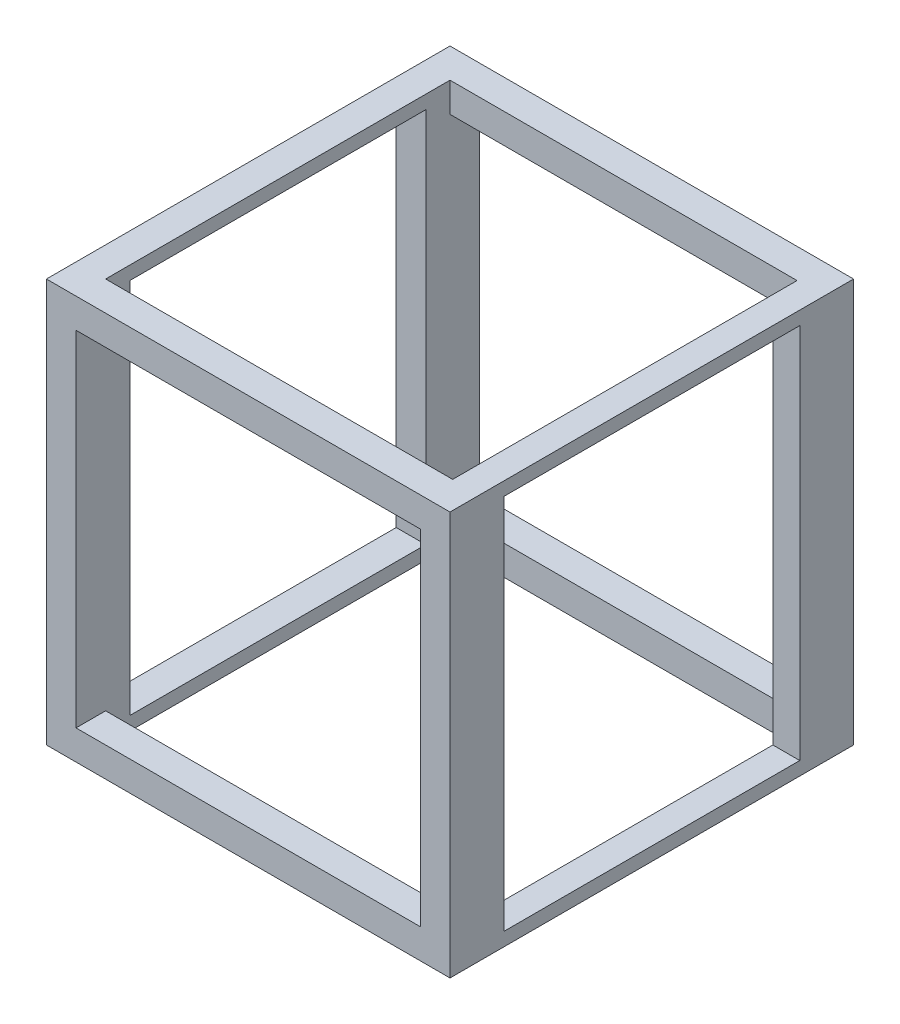
ISO-10303-21;
HEADER;
FILE_DESCRIPTION(('STEP AP214'),'2;1');
FILE_NAME('part.step','',(''),(''),'','','');
FILE_SCHEMA(('AUTOMOTIVE_DESIGN { 1 0 10303 214 1 1 1 1 }'));
ENDSEC;
DATA;
#1=APPLICATION_CONTEXT('core data for automotive mechanical design processes');
#2=APPLICATION_PROTOCOL_DEFINITION('international standard','automotive_design',2000,#1);
#3=PRODUCT_CONTEXT('',#1,'mechanical');
#4=PRODUCT('Part','Part','',(#3));
#5=PRODUCT_RELATED_PRODUCT_CATEGORY('part','',(#4));
#6=PRODUCT_DEFINITION_FORMATION('','',#4);
#7=PRODUCT_DEFINITION_CONTEXT('part definition',#1,'design');
#8=PRODUCT_DEFINITION('design','',#6,#7);
#9=PRODUCT_DEFINITION_SHAPE('','',#8);
#10=(LENGTH_UNIT() NAMED_UNIT(*) SI_UNIT(.MILLI.,.METRE.));
#11=(NAMED_UNIT(*) PLANE_ANGLE_UNIT() SI_UNIT($,.RADIAN.));
#12=(NAMED_UNIT(*) SI_UNIT($,.STERADIAN.) SOLID_ANGLE_UNIT());
#13=UNCERTAINTY_MEASURE_WITH_UNIT(LENGTH_MEASURE(1.E-05),#10,'distance_accuracy_value','');
#14=(GEOMETRIC_REPRESENTATION_CONTEXT(3) GLOBAL_UNCERTAINTY_ASSIGNED_CONTEXT((#13)) GLOBAL_UNIT_ASSIGNED_CONTEXT((#10,
#11,#12)) REPRESENTATION_CONTEXT('',''));
#15=CARTESIAN_POINT('',(0.,0.,0.));
#16=DIRECTION('',(0.,0.,1.));
#17=DIRECTION('',(1.,0.,0.));
#18=AXIS2_PLACEMENT_3D('',#15,#16,#17);
#19=CARTESIAN_POINT('',(0.,50.,-1300.));
#20=DIRECTION('',(0.,0.,-1.));
#21=DIRECTION('',(0.,1.,0.));
#22=AXIS2_PLACEMENT_3D('',#19,#20,#21);
#23=PLANE('',#22);
#24=DIRECTION('',(1.,0.,0.));
#25=VECTOR('',#24,1.);
#26=CARTESIAN_POINT('',(0.,1450.,-1300.));
#27=LINE('',#26,#25);
#28=CARTESIAN_POINT('',(1400.,1450.,-1300.));
#29=VERTEX_POINT('',#28);
#30=CARTESIAN_POINT('',(1500.,1450.,-1300.));
#31=VERTEX_POINT('',#30);
#32=EDGE_CURVE('E329',#29,#31,#27,.T.);
#33=ORIENTED_EDGE('',*,*,#32,.F.);
#34=DIRECTION('',(0.,-1.,0.));
#35=VECTOR('',#34,1.);
#36=CARTESIAN_POINT('',(1400.,50.,-1300.));
#37=LINE('',#36,#35);
#38=CARTESIAN_POINT('',(1400.,50.,-1300.));
#39=VERTEX_POINT('',#38);
#40=EDGE_CURVE('E262',#29,#39,#37,.T.);
#41=ORIENTED_EDGE('',*,*,#40,.T.);
#42=DIRECTION('',(1.,0.,0.));
#43=VECTOR('',#42,1.);
#44=CARTESIAN_POINT('',(0.,50.,-1300.));
#45=LINE('',#44,#43);
#46=CARTESIAN_POINT('',(1500.,50.,-1300.));
#47=VERTEX_POINT('',#46);
#48=EDGE_CURVE('E334',#39,#47,#45,.T.);
#49=ORIENTED_EDGE('',*,*,#48,.T.);
#50=DIRECTION('',(0.,1.,0.));
#51=VECTOR('',#50,1.);
#52=CARTESIAN_POINT('',(1500.,50.,-1300.));
#53=LINE('',#52,#51);
#54=EDGE_CURVE('E305',#47,#31,#53,.T.);
#55=ORIENTED_EDGE('',*,*,#54,.T.);
#56=EDGE_LOOP('',(#33,#41,#49,#55));
#57=FACE_BOUND('',#56,.T.);
#58=ADVANCED_FACE('F34',(#57),#23,.F.);
#59=CARTESIAN_POINT('',(0.,50.,-1300.));
#60=DIRECTION('',(0.,-1.,0.));
#61=DIRECTION('',(0.,0.,-1.));
#62=AXIS2_PLACEMENT_3D('',#59,#60,#61);
#63=PLANE('',#62);
#64=ORIENTED_EDGE('',*,*,#48,.F.);
#65=DIRECTION('',(0.,0.,1.));
#66=VECTOR('',#65,1.);
#67=CARTESIAN_POINT('',(1400.,50.,-1300.));
#68=LINE('',#67,#66);
#69=CARTESIAN_POINT('',(1400.,49.9999999999999,-200.));
#70=VERTEX_POINT('',#69);
#71=EDGE_CURVE('E259',#39,#70,#68,.T.);
#72=ORIENTED_EDGE('',*,*,#71,.T.);
#73=DIRECTION('',(1.,0.,0.));
#74=VECTOR('',#73,1.);
#75=CARTESIAN_POINT('',(-2.22044604925031E-13,49.9999999999999,-200.));
#76=LINE('',#75,#74);
#77=CARTESIAN_POINT('',(1500.,49.9999999999999,-200.));
#78=VERTEX_POINT('',#77);
#79=EDGE_CURVE('E338',#70,#78,#76,.T.);
#80=ORIENTED_EDGE('',*,*,#79,.T.);
#81=DIRECTION('',(0.,0.,-1.));
#82=VECTOR('',#81,1.);
#83=CARTESIAN_POINT('',(1500.,50.,-1300.));
#84=LINE('',#83,#82);
#85=EDGE_CURVE('E314',#78,#47,#84,.T.);
#86=ORIENTED_EDGE('',*,*,#85,.T.);
#87=EDGE_LOOP('',(#64,#72,#80,#86));
#88=FACE_BOUND('',#87,.T.);
#89=ADVANCED_FACE('F428',(#88),#63,.F.);
#90=CARTESIAN_POINT('',(-2.22044604925031E-13,49.9999999999999,-200.));
#91=DIRECTION('',(0.,0.,1.));
#92=DIRECTION('',(0.,-1.,0.));
#93=AXIS2_PLACEMENT_3D('',#90,#91,#92);
#94=PLANE('',#93);
#95=ORIENTED_EDGE('',*,*,#79,.F.);
#96=DIRECTION('',(0.,1.,0.));
#97=VECTOR('',#96,1.);
#98=CARTESIAN_POINT('',(1400.,49.9999999999999,-200.));
#99=LINE('',#98,#97);
#100=CARTESIAN_POINT('',(1400.,1450.,-200.));
#101=VERTEX_POINT('',#100);
#102=EDGE_CURVE('E256',#70,#101,#99,.T.);
#103=ORIENTED_EDGE('',*,*,#102,.T.);
#104=DIRECTION('',(1.,0.,0.));
#105=VECTOR('',#104,1.);
#106=CARTESIAN_POINT('',(-2.22044604925031E-13,1450.,-200.));
#107=LINE('',#106,#105);
#108=CARTESIAN_POINT('',(1500.,1450.,-200.));
#109=VERTEX_POINT('',#108);
#110=EDGE_CURVE('E342',#101,#109,#107,.T.);
#111=ORIENTED_EDGE('',*,*,#110,.T.);
#112=DIRECTION('',(0.,-1.,0.));
#113=VECTOR('',#112,1.);
#114=CARTESIAN_POINT('',(1500.,49.9999999999999,-200.));
#115=LINE('',#114,#113);
#116=EDGE_CURVE('E311',#109,#78,#115,.T.);
#117=ORIENTED_EDGE('',*,*,#116,.T.);
#118=EDGE_LOOP('',(#95,#103,#111,#117));
#119=FACE_BOUND('',#118,.T.);
#120=ADVANCED_FACE('F435',(#119),#94,.F.);
#121=CARTESIAN_POINT('',(0.,1450.,-1300.));
#122=DIRECTION('',(0.,1.,0.));
#123=DIRECTION('',(0.,0.,1.));
#124=AXIS2_PLACEMENT_3D('',#121,#122,#123);
#125=PLANE('',#124);
#126=ORIENTED_EDGE('',*,*,#110,.F.);
#127=DIRECTION('',(0.,0.,-1.));
#128=VECTOR('',#127,1.);
#129=CARTESIAN_POINT('',(1400.,1450.,-1300.));
#130=LINE('',#129,#128);
#131=EDGE_CURVE('E11',#101,#29,#130,.T.);
#132=ORIENTED_EDGE('',*,*,#131,.T.);
#133=ORIENTED_EDGE('',*,*,#32,.T.);
#134=DIRECTION('',(0.,0.,1.));
#135=VECTOR('',#134,1.);
#136=CARTESIAN_POINT('',(1500.,1450.,-1300.));
#137=LINE('',#136,#135);
#138=EDGE_CURVE('E308',#31,#109,#137,.T.);
#139=ORIENTED_EDGE('',*,*,#138,.T.);
#140=EDGE_LOOP('',(#126,#132,#133,#139));
#141=FACE_BOUND('',#140,.T.);
#142=ADVANCED_FACE('F467',(#141),#125,.F.);
#143=CARTESIAN_POINT('',(0.,1500.,0.));
#144=DIRECTION('',(1.,0.,0.));
#145=DIRECTION('',(0.,0.,-1.));
#146=AXIS2_PLACEMENT_3D('',#143,#144,#145);
#147=PLANE('',#146);
#148=DIRECTION('',(0.,0.,-1.));
#149=VECTOR('',#148,1.);
#150=CARTESIAN_POINT('',(0.,50.,-1300.));
#151=LINE('',#150,#149);
#152=CARTESIAN_POINT('',(-2.22044604925031E-13,49.9999999999999,-200.));
#153=VERTEX_POINT('',#152);
#154=CARTESIAN_POINT('',(0.,50.,-1300.));
#155=VERTEX_POINT('',#154);
#156=EDGE_CURVE('E326',#153,#155,#151,.T.);
#157=ORIENTED_EDGE('',*,*,#156,.T.);
#158=DIRECTION('',(0.,1.,0.));
#159=VECTOR('',#158,1.);
#160=CARTESIAN_POINT('',(0.,50.,-1300.));
#161=LINE('',#160,#159);
#162=CARTESIAN_POINT('',(0.,1450.,-1300.));
#163=VERTEX_POINT('',#162);
#164=EDGE_CURVE('E317',#155,#163,#161,.T.);
#165=ORIENTED_EDGE('',*,*,#164,.T.);
#166=DIRECTION('',(0.,0.,1.));
#167=VECTOR('',#166,1.);
#168=CARTESIAN_POINT('',(0.,1450.,-1300.));
#169=LINE('',#168,#167);
#170=CARTESIAN_POINT('',(0.,1450.,-200.));
#171=VERTEX_POINT('',#170);
#172=EDGE_CURVE('E320',#163,#171,#169,.T.);
#173=ORIENTED_EDGE('',*,*,#172,.T.);
#174=DIRECTION('',(0.,-1.,0.));
#175=VECTOR('',#174,1.);
#176=CARTESIAN_POINT('',(-2.22044604925031E-13,49.9999999999999,-200.));
#177=LINE('',#176,#175);
#178=EDGE_CURVE('E323',#171,#153,#177,.T.);
#179=ORIENTED_EDGE('',*,*,#178,.T.);
#180=EDGE_LOOP('',(#157,#165,#173,#179));
#181=FACE_BOUND('',#180,.T.);
#182=DIRECTION('',(0.,0.,1.));
#183=VECTOR('',#182,1.);
#184=CARTESIAN_POINT('',(0.,0.,0.));
#185=LINE('',#184,#183);
#186=CARTESIAN_POINT('',(0.,0.,-1500.));
#187=VERTEX_POINT('',#186);
#188=CARTESIAN_POINT('',(0.,0.,0.));
#189=VERTEX_POINT('',#188);
#190=EDGE_CURVE('E333',#187,#189,#185,.T.);
#191=ORIENTED_EDGE('',*,*,#190,.T.);
#192=DIRECTION('',(0.,-1.,0.));
#193=VECTOR('',#192,1.);
#194=CARTESIAN_POINT('',(0.,1500.,0.));
#195=LINE('',#194,#193);
#196=CARTESIAN_POINT('',(0.,1500.,0.));
#197=VERTEX_POINT('',#196);
#198=EDGE_CURVE('E372',#197,#189,#195,.T.);
#199=ORIENTED_EDGE('',*,*,#198,.F.);
#200=DIRECTION('',(0.,0.,1.));
#201=VECTOR('',#200,1.);
#202=CARTESIAN_POINT('',(0.,1500.,0.));
#203=LINE('',#202,#201);
#204=CARTESIAN_POINT('',(0.,1500.,-1500.));
#205=VERTEX_POINT('',#204);
#206=EDGE_CURVE('E346',#205,#197,#203,.T.);
#207=ORIENTED_EDGE('',*,*,#206,.F.);
#208=DIRECTION('',(0.,-1.,0.));
#209=VECTOR('',#208,1.);
#210=CARTESIAN_POINT('',(0.,1500.,-1500.));
#211=LINE('',#210,#209);
#212=EDGE_CURVE('E356',#205,#187,#211,.T.);
#213=ORIENTED_EDGE('',*,*,#212,.T.);
#214=EDGE_LOOP('',(#191,#199,#207,#213));
#215=FACE_BOUND('',#214,.T.);
#216=ADVANCED_FACE('F36',(#181,#215),#147,.F.);
#217=CARTESIAN_POINT('',(0.,1500.,0.));
#218=DIRECTION('',(0.,0.,-1.));
#219=DIRECTION('',(-1.,0.,0.));
#220=AXIS2_PLACEMENT_3D('',#217,#218,#219);
#221=PLANE('',#220);
#222=DIRECTION('',(1.,0.,0.));
#223=VECTOR('',#222,1.);
#224=CARTESIAN_POINT('',(1390.,1390.,0.));
#225=LINE('',#224,#223);
#226=CARTESIAN_POINT('',(110.,1390.,0.));
#227=VERTEX_POINT('',#226);
#228=CARTESIAN_POINT('',(1390.,1390.,0.));
#229=VERTEX_POINT('',#228);
#230=EDGE_CURVE('E286',#227,#229,#225,.T.);
#231=ORIENTED_EDGE('',*,*,#230,.T.);
#232=DIRECTION('',(0.,-1.,0.));
#233=VECTOR('',#232,1.);
#234=CARTESIAN_POINT('',(1390.,1390.,0.));
#235=LINE('',#234,#233);
#236=CARTESIAN_POINT('',(1390.,110.,0.));
#237=VERTEX_POINT('',#236);
#238=EDGE_CURVE('E277',#229,#237,#235,.T.);
#239=ORIENTED_EDGE('',*,*,#238,.T.);
#240=DIRECTION('',(-1.,0.,0.));
#241=VECTOR('',#240,1.);
#242=CARTESIAN_POINT('',(1390.,110.,0.));
#243=LINE('',#242,#241);
#244=CARTESIAN_POINT('',(110.,110.,0.));
#245=VERTEX_POINT('',#244);
#246=EDGE_CURVE('E280',#237,#245,#243,.T.);
#247=ORIENTED_EDGE('',*,*,#246,.T.);
#248=DIRECTION('',(0.,1.,0.));
#249=VECTOR('',#248,1.);
#250=CARTESIAN_POINT('',(110.,1390.,0.));
#251=LINE('',#250,#249);
#252=EDGE_CURVE('E283',#245,#227,#251,.T.);
#253=ORIENTED_EDGE('',*,*,#252,.T.);
#254=EDGE_LOOP('',(#231,#239,#247,#253));
#255=FACE_BOUND('',#254,.T.);
#256=DIRECTION('',(1.,0.,0.));
#257=VECTOR('',#256,1.);
#258=CARTESIAN_POINT('',(0.,0.,0.));
#259=LINE('',#258,#257);
#260=CARTESIAN_POINT('',(1500.,0.,0.));
#261=VERTEX_POINT('',#260);
#262=EDGE_CURVE('E359',#189,#261,#259,.T.);
#263=ORIENTED_EDGE('',*,*,#262,.T.);
#264=DIRECTION('',(0.,-1.,0.));
#265=VECTOR('',#264,1.);
#266=CARTESIAN_POINT('',(1500.,1500.,0.));
#267=LINE('',#266,#265);
#268=CARTESIAN_POINT('',(1500.,1500.,0.));
#269=VERTEX_POINT('',#268);
#270=EDGE_CURVE('E369',#269,#261,#267,.T.);
#271=ORIENTED_EDGE('',*,*,#270,.F.);
#272=DIRECTION('',(1.,0.,0.));
#273=VECTOR('',#272,1.);
#274=CARTESIAN_POINT('',(0.,1500.,0.));
#275=LINE('',#274,#273);
#276=EDGE_CURVE('E349',#197,#269,#275,.T.);
#277=ORIENTED_EDGE('',*,*,#276,.F.);
#278=ORIENTED_EDGE('',*,*,#198,.T.);
#279=EDGE_LOOP('',(#263,#271,#277,#278));
#280=FACE_BOUND('',#279,.T.);
#281=ADVANCED_FACE('F387',(#255,#280),#221,.F.);
#282=CARTESIAN_POINT('',(1500.,1500.,0.));
#283=DIRECTION('',(-1.,0.,0.));
#284=DIRECTION('',(0.,0.,1.));
#285=AXIS2_PLACEMENT_3D('',#282,#283,#284);
#286=PLANE('',#285);
#287=ORIENTED_EDGE('',*,*,#138,.F.);
#288=ORIENTED_EDGE('',*,*,#54,.F.);
#289=ORIENTED_EDGE('',*,*,#85,.F.);
#290=ORIENTED_EDGE('',*,*,#116,.F.);
#291=EDGE_LOOP('',(#287,#288,#289,#290));
#292=FACE_BOUND('',#291,.T.);
#293=DIRECTION('',(0.,0.,-1.));
#294=VECTOR('',#293,1.);
#295=CARTESIAN_POINT('',(1500.,0.,0.));
#296=LINE('',#295,#294);
#297=CARTESIAN_POINT('',(1500.,0.,-1500.));
#298=VERTEX_POINT('',#297);
#299=EDGE_CURVE('E361',#261,#298,#296,.T.);
#300=ORIENTED_EDGE('',*,*,#299,.T.);
#301=DIRECTION('',(0.,-1.,0.));
#302=VECTOR('',#301,1.);
#303=CARTESIAN_POINT('',(1500.,1500.,-1500.));
#304=LINE('',#303,#302);
#305=CARTESIAN_POINT('',(1500.,1500.,-1500.));
#306=VERTEX_POINT('',#305);
#307=EDGE_CURVE('E366',#306,#298,#304,.T.);
#308=ORIENTED_EDGE('',*,*,#307,.F.);
#309=DIRECTION('',(0.,0.,-1.));
#310=VECTOR('',#309,1.);
#311=CARTESIAN_POINT('',(1500.,1500.,0.));
#312=LINE('',#311,#310);
#313=EDGE_CURVE('E352',#269,#306,#312,.T.);
#314=ORIENTED_EDGE('',*,*,#313,.F.);
#315=ORIENTED_EDGE('',*,*,#270,.T.);
#316=EDGE_LOOP('',(#300,#308,#314,#315));
#317=FACE_BOUND('',#316,.T.);
#318=ADVANCED_FACE('F482',(#292,#317),#286,.F.);
#319=CARTESIAN_POINT('',(0.,1500.,-1500.));
#320=DIRECTION('',(0.,0.,1.));
#321=DIRECTION('',(1.,0.,0.));
#322=AXIS2_PLACEMENT_3D('',#319,#320,#321);
#323=PLANE('',#322);
#324=DIRECTION('',(-1.,0.,0.));
#325=VECTOR('',#324,1.);
#326=CARTESIAN_POINT('',(1390.,110.,-1500.));
#327=LINE('',#326,#325);
#328=CARTESIAN_POINT('',(1390.,110.,-1500.));
#329=VERTEX_POINT('',#328);
#330=CARTESIAN_POINT('',(110.,110.,-1500.));
#331=VERTEX_POINT('',#330);
#332=EDGE_CURVE('E268',#329,#331,#327,.T.);
#333=ORIENTED_EDGE('',*,*,#332,.F.);
#334=DIRECTION('',(0.,-1.,0.));
#335=VECTOR('',#334,1.);
#336=CARTESIAN_POINT('',(1390.,1390.,-1500.));
#337=LINE('',#336,#335);
#338=CARTESIAN_POINT('',(1390.,1390.,-1500.));
#339=VERTEX_POINT('',#338);
#340=EDGE_CURVE('E265',#339,#329,#337,.T.);
#341=ORIENTED_EDGE('',*,*,#340,.F.);
#342=DIRECTION('',(1.,0.,0.));
#343=VECTOR('',#342,1.);
#344=CARTESIAN_POINT('',(1390.,1390.,-1500.));
#345=LINE('',#344,#343);
#346=CARTESIAN_POINT('',(110.,1390.,-1500.));
#347=VERTEX_POINT('',#346);
#348=EDGE_CURVE('E274',#347,#339,#345,.T.);
#349=ORIENTED_EDGE('',*,*,#348,.F.);
#350=DIRECTION('',(0.,1.,0.));
#351=VECTOR('',#350,1.);
#352=CARTESIAN_POINT('',(110.,1390.,-1500.));
#353=LINE('',#352,#351);
#354=EDGE_CURVE('E271',#331,#347,#353,.T.);
#355=ORIENTED_EDGE('',*,*,#354,.F.);
#356=EDGE_LOOP('',(#333,#341,#349,#355));
#357=FACE_BOUND('',#356,.T.);
#358=DIRECTION('',(-1.,0.,0.));
#359=VECTOR('',#358,1.);
#360=CARTESIAN_POINT('',(0.,0.,-1500.));
#361=LINE('',#360,#359);
#362=EDGE_CURVE('E350',#298,#187,#361,.T.);
#363=ORIENTED_EDGE('',*,*,#362,.T.);
#364=ORIENTED_EDGE('',*,*,#212,.F.);
#365=DIRECTION('',(-1.,0.,0.));
#366=VECTOR('',#365,1.);
#367=CARTESIAN_POINT('',(0.,1500.,-1500.));
#368=LINE('',#367,#366);
#369=EDGE_CURVE('E354',#306,#205,#368,.T.);
#370=ORIENTED_EDGE('',*,*,#369,.F.);
#371=ORIENTED_EDGE('',*,*,#307,.T.);
#372=EDGE_LOOP('',(#363,#364,#370,#371));
#373=FACE_BOUND('',#372,.T.);
#374=ADVANCED_FACE('F411',(#357,#373),#323,.F.);
#375=CARTESIAN_POINT('',(0.,1500.,0.));
#376=DIRECTION('',(0.,-1.,0.));
#377=DIRECTION('',(0.,0.,-1.));
#378=AXIS2_PLACEMENT_3D('',#375,#376,#377);
#379=PLANE('',#378);
#380=DIRECTION('',(1.,0.,0.));
#381=VECTOR('',#380,1.);
#382=CARTESIAN_POINT('',(1400.,1500.,-1390.));
#383=LINE('',#382,#381);
#384=CARTESIAN_POINT('',(110.,1500.,-1390.));
#385=VERTEX_POINT('',#384);
#386=CARTESIAN_POINT('',(1400.,1500.,-1390.));
#387=VERTEX_POINT('',#386);
#388=EDGE_CURVE('E230',#385,#387,#383,.T.);
#389=ORIENTED_EDGE('',*,*,#388,.T.);
#390=DIRECTION('',(0.,0.,1.));
#391=VECTOR('',#390,1.);
#392=CARTESIAN_POINT('',(1400.,1500.,-110.));
#393=LINE('',#392,#391);
#394=CARTESIAN_POINT('',(1400.,1500.,-110.));
#395=VERTEX_POINT('',#394);
#396=EDGE_CURVE('E220',#387,#395,#393,.T.);
#397=ORIENTED_EDGE('',*,*,#396,.T.);
#398=DIRECTION('',(-1.,0.,0.));
#399=VECTOR('',#398,1.);
#400=CARTESIAN_POINT('',(1400.,1500.,-110.));
#401=LINE('',#400,#399);
#402=CARTESIAN_POINT('',(110.,1500.,-110.));
#403=VERTEX_POINT('',#402);
#404=EDGE_CURVE('E226',#395,#403,#401,.T.);
#405=ORIENTED_EDGE('',*,*,#404,.T.);
#406=DIRECTION('',(0.,0.,-1.));
#407=VECTOR('',#406,1.);
#408=CARTESIAN_POINT('',(110.,1500.,-110.));
#409=LINE('',#408,#407);
#410=EDGE_CURVE('E49',#403,#385,#409,.T.);
#411=ORIENTED_EDGE('',*,*,#410,.T.);
#412=EDGE_LOOP('',(#389,#397,#405,#411));
#413=FACE_BOUND('',#412,.T.);
#414=ORIENTED_EDGE('',*,*,#206,.T.);
#415=ORIENTED_EDGE('',*,*,#276,.T.);
#416=ORIENTED_EDGE('',*,*,#313,.T.);
#417=ORIENTED_EDGE('',*,*,#369,.T.);
#418=EDGE_LOOP('',(#414,#415,#416,#417));
#419=FACE_BOUND('',#418,.T.);
#420=ADVANCED_FACE('F393',(#413,#419),#379,.F.);
#421=CARTESIAN_POINT('',(0.,0.,0.));
#422=DIRECTION('',(0.,-1.,0.));
#423=DIRECTION('',(0.,0.,-1.));
#424=AXIS2_PLACEMENT_3D('',#421,#422,#423);
#425=PLANE('',#424);
#426=DIRECTION('',(0.,0.,1.));
#427=VECTOR('',#426,1.);
#428=CARTESIAN_POINT('',(1400.,0.,-110.));
#429=LINE('',#428,#427);
#430=CARTESIAN_POINT('',(1400.,0.,-1390.));
#431=VERTEX_POINT('',#430);
#432=CARTESIAN_POINT('',(1400.,0.,-110.));
#433=VERTEX_POINT('',#432);
#434=EDGE_CURVE('E57',#431,#433,#429,.T.);
#435=ORIENTED_EDGE('',*,*,#434,.F.);
#436=DIRECTION('',(1.,0.,0.));
#437=VECTOR('',#436,1.);
#438=CARTESIAN_POINT('',(1400.,0.,-1390.));
#439=LINE('',#438,#437);
#440=CARTESIAN_POINT('',(110.,0.,-1390.));
#441=VERTEX_POINT('',#440);
#442=EDGE_CURVE('E218',#441,#431,#439,.T.);
#443=ORIENTED_EDGE('',*,*,#442,.F.);
#444=DIRECTION('',(0.,0.,-1.));
#445=VECTOR('',#444,1.);
#446=CARTESIAN_POINT('',(110.,0.,-110.));
#447=LINE('',#446,#445);
#448=CARTESIAN_POINT('',(110.,0.,-110.));
#449=VERTEX_POINT('',#448);
#450=EDGE_CURVE('E200',#449,#441,#447,.T.);
#451=ORIENTED_EDGE('',*,*,#450,.F.);
#452=DIRECTION('',(-1.,0.,0.));
#453=VECTOR('',#452,1.);
#454=CARTESIAN_POINT('',(1400.,0.,-110.));
#455=LINE('',#454,#453);
#456=EDGE_CURVE('E210',#433,#449,#455,.T.);
#457=ORIENTED_EDGE('',*,*,#456,.F.);
#458=EDGE_LOOP('',(#435,#443,#451,#457));
#459=FACE_BOUND('',#458,.T.);
#460=ORIENTED_EDGE('',*,*,#190,.F.);
#461=ORIENTED_EDGE('',*,*,#362,.F.);
#462=ORIENTED_EDGE('',*,*,#299,.F.);
#463=ORIENTED_EDGE('',*,*,#262,.F.);
#464=EDGE_LOOP('',(#460,#461,#462,#463));
#465=FACE_BOUND('',#464,.T.);
#466=ADVANCED_FACE('F215',(#459,#465),#425,.T.);
#467=CARTESIAN_POINT('',(110.,50.,-1300.));
#468=VERTEX_POINT('',#467);
#469=EDGE_CURVE('E330',#155,#468,#45,.T.);
#470=ORIENTED_EDGE('',*,*,#469,.T.);
#471=DIRECTION('',(0.,1.,0.));
#472=VECTOR('',#471,1.);
#473=CARTESIAN_POINT('',(110.,50.,-1300.));
#474=LINE('',#473,#472);
#475=CARTESIAN_POINT('',(110.,1450.,-1300.));
#476=VERTEX_POINT('',#475);
#477=EDGE_CURVE('E293',#468,#476,#474,.T.);
#478=ORIENTED_EDGE('',*,*,#477,.T.);
#479=EDGE_CURVE('E343',#163,#476,#27,.T.);
#480=ORIENTED_EDGE('',*,*,#479,.F.);
#481=ORIENTED_EDGE('',*,*,#164,.F.);
#482=EDGE_LOOP('',(#470,#478,#480,#481));
#483=FACE_BOUND('',#482,.T.);
#484=ADVANCED_FACE('F431',(#483),#23,.F.);
#485=CARTESIAN_POINT('',(110.,49.9999999999999,-200.));
#486=VERTEX_POINT('',#485);
#487=EDGE_CURVE('E335',#153,#486,#76,.T.);
#488=ORIENTED_EDGE('',*,*,#487,.T.);
#489=DIRECTION('',(0.,0.,-1.));
#490=VECTOR('',#489,1.);
#491=CARTESIAN_POINT('',(110.,50.,-1300.));
#492=LINE('',#491,#490);
#493=EDGE_CURVE('E242',#486,#468,#492,.T.);
#494=ORIENTED_EDGE('',*,*,#493,.T.);
#495=ORIENTED_EDGE('',*,*,#469,.F.);
#496=ORIENTED_EDGE('',*,*,#156,.F.);
#497=EDGE_LOOP('',(#488,#494,#495,#496));
#498=FACE_BOUND('',#497,.T.);
#499=ADVANCED_FACE('F437',(#498),#63,.F.);
#500=CARTESIAN_POINT('',(110.,1450.,-200.));
#501=VERTEX_POINT('',#500);
#502=EDGE_CURVE('E339',#171,#501,#107,.T.);
#503=ORIENTED_EDGE('',*,*,#502,.T.);
#504=DIRECTION('',(0.,-1.,0.));
#505=VECTOR('',#504,1.);
#506=CARTESIAN_POINT('',(110.,49.9999999999999,-200.));
#507=LINE('',#506,#505);
#508=EDGE_CURVE('E375',#501,#486,#507,.T.);
#509=ORIENTED_EDGE('',*,*,#508,.T.);
#510=ORIENTED_EDGE('',*,*,#487,.F.);
#511=ORIENTED_EDGE('',*,*,#178,.F.);
#512=EDGE_LOOP('',(#503,#509,#510,#511));
#513=FACE_BOUND('',#512,.T.);
#514=ADVANCED_FACE('F447',(#513),#94,.F.);
#515=ORIENTED_EDGE('',*,*,#479,.T.);
#516=DIRECTION('',(0.,0.,1.));
#517=VECTOR('',#516,1.);
#518=CARTESIAN_POINT('',(110.,1450.,-1300.));
#519=LINE('',#518,#517);
#520=EDGE_CURVE('E235',#476,#501,#519,.T.);
#521=ORIENTED_EDGE('',*,*,#520,.T.);
#522=ORIENTED_EDGE('',*,*,#502,.F.);
#523=ORIENTED_EDGE('',*,*,#172,.F.);
#524=EDGE_LOOP('',(#515,#521,#522,#523));
#525=FACE_BOUND('',#524,.T.);
#526=ADVANCED_FACE('F458',(#525),#125,.F.);
#527=CARTESIAN_POINT('',(1390.,110.,0.));
#528=DIRECTION('',(0.,-1.,0.));
#529=DIRECTION('',(0.,0.,-1.));
#530=AXIS2_PLACEMENT_3D('',#527,#528,#529);
#531=PLANE('',#530);
#532=DIRECTION('',(0.,0.,-1.));
#533=VECTOR('',#532,1.);
#534=CARTESIAN_POINT('',(1390.,110.,0.));
#535=LINE('',#534,#533);
#536=CARTESIAN_POINT('',(1390.,110.,-110.));
#537=VERTEX_POINT('',#536);
#538=EDGE_CURVE('E301',#237,#537,#535,.T.);
#539=ORIENTED_EDGE('',*,*,#538,.T.);
#540=DIRECTION('',(-1.,0.,0.));
#541=VECTOR('',#540,1.);
#542=CARTESIAN_POINT('',(1390.,110.,-110.));
#543=LINE('',#542,#541);
#544=CARTESIAN_POINT('',(110.,110.,-110.));
#545=VERTEX_POINT('',#544);
#546=EDGE_CURVE('E254',#537,#545,#543,.T.);
#547=ORIENTED_EDGE('',*,*,#546,.T.);
#548=DIRECTION('',(0.,0.,-1.));
#549=VECTOR('',#548,1.);
#550=CARTESIAN_POINT('',(110.,110.,0.));
#551=LINE('',#550,#549);
#552=EDGE_CURVE('E203',#245,#545,#551,.T.);
#553=ORIENTED_EDGE('',*,*,#552,.F.);
#554=ORIENTED_EDGE('',*,*,#246,.F.);
#555=EDGE_LOOP('',(#539,#547,#553,#554));
#556=FACE_BOUND('',#555,.T.);
#557=ADVANCED_FACE('F385',(#556),#531,.F.);
#558=CARTESIAN_POINT('',(1390.,1390.,0.));
#559=DIRECTION('',(0.,1.,0.));
#560=DIRECTION('',(0.,0.,1.));
#561=AXIS2_PLACEMENT_3D('',#558,#559,#560);
#562=PLANE('',#561);
#563=DIRECTION('',(0.,0.,-1.));
#564=VECTOR('',#563,1.);
#565=CARTESIAN_POINT('',(110.,1390.,0.));
#566=LINE('',#565,#564);
#567=CARTESIAN_POINT('',(110.,1390.,-110.));
#568=VERTEX_POINT('',#567);
#569=EDGE_CURVE('E295',#227,#568,#566,.T.);
#570=ORIENTED_EDGE('',*,*,#569,.T.);
#571=DIRECTION('',(1.,0.,0.));
#572=VECTOR('',#571,1.);
#573=CARTESIAN_POINT('',(1390.,1390.,-110.));
#574=LINE('',#573,#572);
#575=CARTESIAN_POINT('',(1390.,1390.,-110.));
#576=VERTEX_POINT('',#575);
#577=EDGE_CURVE('E251',#568,#576,#574,.T.);
#578=ORIENTED_EDGE('',*,*,#577,.T.);
#579=DIRECTION('',(0.,0.,-1.));
#580=VECTOR('',#579,1.);
#581=CARTESIAN_POINT('',(1390.,1390.,0.));
#582=LINE('',#581,#580);
#583=EDGE_CURVE('E290',#229,#576,#582,.T.);
#584=ORIENTED_EDGE('',*,*,#583,.F.);
#585=ORIENTED_EDGE('',*,*,#230,.F.);
#586=EDGE_LOOP('',(#570,#578,#584,#585));
#587=FACE_BOUND('',#586,.T.);
#588=ADVANCED_FACE('F391',(#587),#562,.F.);
#589=CARTESIAN_POINT('',(1390.,1390.,0.));
#590=DIRECTION('',(1.,0.,0.));
#591=DIRECTION('',(0.,1.,0.));
#592=AXIS2_PLACEMENT_3D('',#589,#590,#591);
#593=PLANE('',#592);
#594=ORIENTED_EDGE('',*,*,#583,.T.);
#595=DIRECTION('',(0.,-1.,0.));
#596=VECTOR('',#595,1.);
#597=CARTESIAN_POINT('',(1390.,1390.,-110.));
#598=LINE('',#597,#596);
#599=EDGE_CURVE('E42',#576,#537,#598,.T.);
#600=ORIENTED_EDGE('',*,*,#599,.T.);
#601=ORIENTED_EDGE('',*,*,#538,.F.);
#602=ORIENTED_EDGE('',*,*,#238,.F.);
#603=EDGE_LOOP('',(#594,#600,#601,#602));
#604=FACE_BOUND('',#603,.T.);
#605=ADVANCED_FACE('F381',(#604),#593,.F.);
#606=CARTESIAN_POINT('',(1390.,110.,-1390.));
#607=VERTEX_POINT('',#606);
#608=EDGE_CURVE('E289',#607,#329,#535,.T.);
#609=ORIENTED_EDGE('',*,*,#608,.F.);
#610=DIRECTION('',(0.,1.,0.));
#611=VECTOR('',#610,1.);
#612=CARTESIAN_POINT('',(1390.,1390.,-1390.));
#613=LINE('',#612,#611);
#614=CARTESIAN_POINT('',(1390.,1390.,-1390.));
#615=VERTEX_POINT('',#614);
#616=EDGE_CURVE('E245',#607,#615,#613,.T.);
#617=ORIENTED_EDGE('',*,*,#616,.T.);
#618=EDGE_CURVE('E294',#615,#339,#582,.T.);
#619=ORIENTED_EDGE('',*,*,#618,.T.);
#620=ORIENTED_EDGE('',*,*,#340,.T.);
#621=EDGE_LOOP('',(#609,#617,#619,#620));
#622=FACE_BOUND('',#621,.T.);
#623=ADVANCED_FACE('F417',(#622),#593,.F.);
#624=ORIENTED_EDGE('',*,*,#618,.F.);
#625=DIRECTION('',(-1.,0.,0.));
#626=VECTOR('',#625,1.);
#627=CARTESIAN_POINT('',(1390.,1390.,-1390.));
#628=LINE('',#627,#626);
#629=CARTESIAN_POINT('',(110.,1390.,-1390.));
#630=VERTEX_POINT('',#629);
#631=EDGE_CURVE('E248',#615,#630,#628,.T.);
#632=ORIENTED_EDGE('',*,*,#631,.T.);
#633=EDGE_CURVE('E298',#630,#347,#566,.T.);
#634=ORIENTED_EDGE('',*,*,#633,.T.);
#635=ORIENTED_EDGE('',*,*,#348,.T.);
#636=EDGE_LOOP('',(#624,#632,#634,#635));
#637=FACE_BOUND('',#636,.T.);
#638=ADVANCED_FACE('F415',(#637),#562,.F.);
#639=CARTESIAN_POINT('',(110.,1390.,0.));
#640=DIRECTION('',(-1.,0.,0.));
#641=DIRECTION('',(0.,-1.,0.));
#642=AXIS2_PLACEMENT_3D('',#639,#640,#641);
#643=PLANE('',#642);
#644=ORIENTED_EDGE('',*,*,#493,.F.);
#645=ORIENTED_EDGE('',*,*,#508,.F.);
#646=ORIENTED_EDGE('',*,*,#520,.F.);
#647=ORIENTED_EDGE('',*,*,#477,.F.);
#648=EDGE_LOOP('',(#644,#645,#646,#647));
#649=FACE_BOUND('',#648,.T.);
#650=ORIENTED_EDGE('',*,*,#633,.F.);
#651=DIRECTION('',(0.,-1.,0.));
#652=VECTOR('',#651,1.);
#653=CARTESIAN_POINT('',(110.,1500.,-1390.));
#654=LINE('',#653,#652);
#655=EDGE_CURVE('E236',#385,#630,#654,.T.);
#656=ORIENTED_EDGE('',*,*,#655,.F.);
#657=ORIENTED_EDGE('',*,*,#410,.F.);
#658=DIRECTION('',(0.,-1.,0.));
#659=VECTOR('',#658,1.);
#660=CARTESIAN_POINT('',(110.,1500.,-110.));
#661=LINE('',#660,#659);
#662=EDGE_CURVE('E206',#403,#568,#661,.T.);
#663=ORIENTED_EDGE('',*,*,#662,.T.);
#664=ORIENTED_EDGE('',*,*,#569,.F.);
#665=ORIENTED_EDGE('',*,*,#252,.F.);
#666=ORIENTED_EDGE('',*,*,#552,.T.);
#667=EDGE_CURVE('E195',#545,#449,#661,.T.);
#668=ORIENTED_EDGE('',*,*,#667,.T.);
#669=ORIENTED_EDGE('',*,*,#450,.T.);
#670=CARTESIAN_POINT('',(110.,110.,-1390.));
#671=VERTEX_POINT('',#670);
#672=EDGE_CURVE('E237',#671,#441,#654,.T.);
#673=ORIENTED_EDGE('',*,*,#672,.F.);
#674=EDGE_CURVE('E300',#671,#331,#551,.T.);
#675=ORIENTED_EDGE('',*,*,#674,.T.);
#676=ORIENTED_EDGE('',*,*,#354,.T.);
#677=EDGE_LOOP('',(#650,#656,#657,#663,#664,#665,#666,#668,#669,#673,#675,#676));
#678=FACE_BOUND('',#677,.T.);
#679=ADVANCED_FACE('F198',(#649,#678),#643,.F.);
#680=ORIENTED_EDGE('',*,*,#674,.F.);
#681=DIRECTION('',(1.,0.,0.));
#682=VECTOR('',#681,1.);
#683=CARTESIAN_POINT('',(1390.,110.,-1390.));
#684=LINE('',#683,#682);
#685=EDGE_CURVE('E377',#671,#607,#684,.T.);
#686=ORIENTED_EDGE('',*,*,#685,.T.);
#687=ORIENTED_EDGE('',*,*,#608,.T.);
#688=ORIENTED_EDGE('',*,*,#332,.T.);
#689=EDGE_LOOP('',(#680,#686,#687,#688));
#690=FACE_BOUND('',#689,.T.);
#691=ADVANCED_FACE('F407',(#690),#531,.F.);
#692=CARTESIAN_POINT('',(1400.,1500.,-110.));
#693=DIRECTION('',(1.,0.,0.));
#694=DIRECTION('',(0.,0.,-1.));
#695=AXIS2_PLACEMENT_3D('',#692,#693,#694);
#696=PLANE('',#695);
#697=DIRECTION('',(0.,-1.,0.));
#698=VECTOR('',#697,1.);
#699=CARTESIAN_POINT('',(1400.,1500.,-110.));
#700=LINE('',#699,#698);
#701=EDGE_CURVE('E207',#395,#433,#700,.T.);
#702=ORIENTED_EDGE('',*,*,#701,.F.);
#703=ORIENTED_EDGE('',*,*,#396,.F.);
#704=DIRECTION('',(0.,-1.,0.));
#705=VECTOR('',#704,1.);
#706=CARTESIAN_POINT('',(1400.,1500.,-1390.));
#707=LINE('',#706,#705);
#708=EDGE_CURVE('E233',#387,#431,#707,.T.);
#709=ORIENTED_EDGE('',*,*,#708,.T.);
#710=ORIENTED_EDGE('',*,*,#434,.T.);
#711=EDGE_LOOP('',(#702,#703,#709,#710));
#712=FACE_BOUND('',#711,.T.);
#713=ORIENTED_EDGE('',*,*,#131,.F.);
#714=ORIENTED_EDGE('',*,*,#102,.F.);
#715=ORIENTED_EDGE('',*,*,#71,.F.);
#716=ORIENTED_EDGE('',*,*,#40,.F.);
#717=EDGE_LOOP('',(#713,#714,#715,#716));
#718=FACE_BOUND('',#717,.T.);
#719=ADVANCED_FACE('F397',(#712,#718),#696,.F.);
#720=CARTESIAN_POINT('',(1400.,1500.,-110.));
#721=DIRECTION('',(0.,0.,1.));
#722=DIRECTION('',(1.,0.,0.));
#723=AXIS2_PLACEMENT_3D('',#720,#721,#722);
#724=PLANE('',#723);
#725=ORIENTED_EDGE('',*,*,#599,.F.);
#726=ORIENTED_EDGE('',*,*,#577,.F.);
#727=ORIENTED_EDGE('',*,*,#662,.F.);
#728=ORIENTED_EDGE('',*,*,#404,.F.);
#729=ORIENTED_EDGE('',*,*,#701,.T.);
#730=ORIENTED_EDGE('',*,*,#456,.T.);
#731=ORIENTED_EDGE('',*,*,#667,.F.);
#732=ORIENTED_EDGE('',*,*,#546,.F.);
#733=EDGE_LOOP('',(#725,#726,#727,#728,#729,#730,#731,#732));
#734=FACE_BOUND('',#733,.T.);
#735=ADVANCED_FACE('F211',(#734),#724,.F.);
#736=CARTESIAN_POINT('',(1400.,1500.,-1390.));
#737=DIRECTION('',(0.,0.,-1.));
#738=DIRECTION('',(-1.,0.,0.));
#739=AXIS2_PLACEMENT_3D('',#736,#737,#738);
#740=PLANE('',#739);
#741=ORIENTED_EDGE('',*,*,#616,.F.);
#742=ORIENTED_EDGE('',*,*,#685,.F.);
#743=ORIENTED_EDGE('',*,*,#672,.T.);
#744=ORIENTED_EDGE('',*,*,#442,.T.);
#745=ORIENTED_EDGE('',*,*,#708,.F.);
#746=ORIENTED_EDGE('',*,*,#388,.F.);
#747=ORIENTED_EDGE('',*,*,#655,.T.);
#748=ORIENTED_EDGE('',*,*,#631,.F.);
#749=EDGE_LOOP('',(#741,#742,#743,#744,#745,#746,#747,#748));
#750=FACE_BOUND('',#749,.T.);
#751=ADVANCED_FACE('F400',(#750),#740,.F.);
#752=CLOSED_SHELL('',(#58,#89,#120,#142,#216,#281,#318,#374,#420,#466,#484,#499,#514,#526,#557,
#588,#605,#623,#638,#679,#691,#719,#735,#751));
#753=MANIFOLD_SOLID_BREP('B2',#752);
#754=ADVANCED_BREP_SHAPE_REPRESENTATION('',(#18,#753),#14);
#755=SHAPE_DEFINITION_REPRESENTATION(#9,#754);
ENDSEC;
END-ISO-10303-21;
